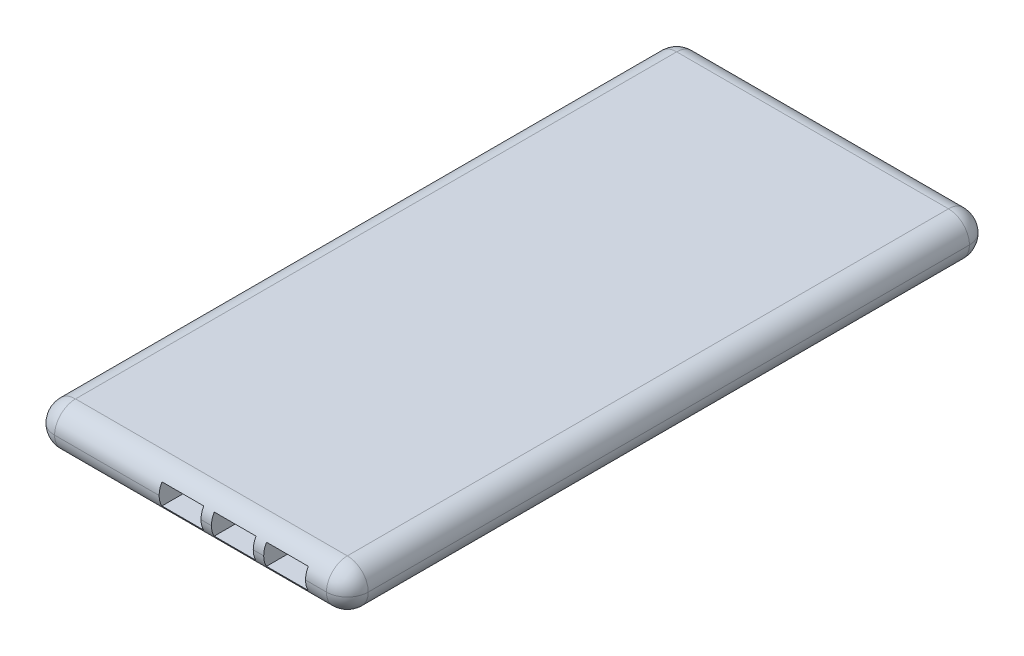
ISO-10303-21;
HEADER;
FILE_DESCRIPTION(('STEP AP214'),'2;1');
FILE_NAME('part.step','',(''),(''),'','','');
FILE_SCHEMA(('AUTOMOTIVE_DESIGN { 1 0 10303 214 1 1 1 1 }'));
ENDSEC;
DATA;
#1=APPLICATION_CONTEXT('core data for automotive mechanical design processes');
#2=APPLICATION_PROTOCOL_DEFINITION('international standard','automotive_design',2000,#1);
#3=PRODUCT_CONTEXT('',#1,'mechanical');
#4=PRODUCT('Part','Part','',(#3));
#5=PRODUCT_RELATED_PRODUCT_CATEGORY('part','',(#4));
#6=PRODUCT_DEFINITION_FORMATION('','',#4);
#7=PRODUCT_DEFINITION_CONTEXT('part definition',#1,'design');
#8=PRODUCT_DEFINITION('design','',#6,#7);
#9=PRODUCT_DEFINITION_SHAPE('','',#8);
#10=(LENGTH_UNIT() NAMED_UNIT(*) SI_UNIT(.MILLI.,.METRE.));
#11=(NAMED_UNIT(*) PLANE_ANGLE_UNIT() SI_UNIT($,.RADIAN.));
#12=(NAMED_UNIT(*) SI_UNIT($,.STERADIAN.) SOLID_ANGLE_UNIT());
#13=UNCERTAINTY_MEASURE_WITH_UNIT(LENGTH_MEASURE(1.E-05),#10,'distance_accuracy_value','');
#14=(GEOMETRIC_REPRESENTATION_CONTEXT(3) GLOBAL_UNCERTAINTY_ASSIGNED_CONTEXT((#13)) GLOBAL_UNIT_ASSIGNED_CONTEXT((#10,
#11,#12)) REPRESENTATION_CONTEXT('',''));
#15=CARTESIAN_POINT('',(0.,0.,0.));
#16=DIRECTION('',(0.,0.,1.));
#17=DIRECTION('',(1.,0.,0.));
#18=AXIS2_PLACEMENT_3D('',#15,#16,#17);
#19=CARTESIAN_POINT('',(0.,6.35,-6.35));
#20=DIRECTION('',(-1.,0.,0.));
#21=DIRECTION('',(0.,0.,1.));
#22=AXIS2_PLACEMENT_3D('',#19,#20,#21);
#23=CYLINDRICAL_SURFACE('',#22,6.35);
#24=DIRECTION('',(1.,0.,0.));
#25=VECTOR('',#24,1.);
#26=CARTESIAN_POINT('',(95.25,6.35,0.));
#27=LINE('',#26,#25);
#28=CARTESIAN_POINT('',(82.55,6.35,0.));
#29=VERTEX_POINT('',#28);
#30=CARTESIAN_POINT('',(88.9,6.35,0.));
#31=VERTEX_POINT('',#30);
#32=EDGE_CURVE('E319',#29,#31,#27,.T.);
#33=ORIENTED_EDGE('',*,*,#32,.F.);
#34=CARTESIAN_POINT('',(82.55,6.35,-6.35));
#35=DIRECTION('',(-1.,0.,0.));
#36=DIRECTION('',(0.,0.,1.));
#37=AXIS2_PLACEMENT_3D('',#34,#35,#36);
#38=CIRCLE('',#37,6.35);
#39=CARTESIAN_POINT('',(82.55,3.175,-0.850738685968817));
#40=VERTEX_POINT('',#39);
#41=EDGE_CURVE('E275',#29,#40,#38,.F.);
#42=ORIENTED_EDGE('',*,*,#41,.T.);
#43=DIRECTION('',(-1.,0.,0.));
#44=VECTOR('',#43,1.);
#45=CARTESIAN_POINT('',(0.,3.175,-0.850738685968816));
#46=LINE('',#45,#44);
#47=CARTESIAN_POINT('',(69.85,3.175,-0.850738685968816));
#48=VERTEX_POINT('',#47);
#49=EDGE_CURVE('E11',#40,#48,#46,.T.);
#50=ORIENTED_EDGE('',*,*,#49,.T.);
#51=CARTESIAN_POINT('',(69.85,6.35,-6.35));
#52=DIRECTION('',(1.,0.,0.));
#53=DIRECTION('',(0.,0.,-1.));
#54=AXIS2_PLACEMENT_3D('',#51,#52,#53);
#55=CIRCLE('',#54,6.35);
#56=CARTESIAN_POINT('',(69.85,6.35,0.));
#57=VERTEX_POINT('',#56);
#58=EDGE_CURVE('E272',#48,#57,#55,.F.);
#59=ORIENTED_EDGE('',*,*,#58,.T.);
#60=CARTESIAN_POINT('',(66.675,6.35,0.));
#61=VERTEX_POINT('',#60);
#62=EDGE_CURVE('E417',#61,#57,#27,.T.);
#63=ORIENTED_EDGE('',*,*,#62,.F.);
#64=CARTESIAN_POINT('',(66.675,6.35,-6.35));
#65=DIRECTION('',(-1.,0.,0.));
#66=DIRECTION('',(0.,0.,1.));
#67=AXIS2_PLACEMENT_3D('',#64,#65,#66);
#68=CIRCLE('',#67,6.35);
#69=CARTESIAN_POINT('',(66.675,3.175,-0.850738685968817));
#70=VERTEX_POINT('',#69);
#71=EDGE_CURVE('E64',#61,#70,#68,.F.);
#72=ORIENTED_EDGE('',*,*,#71,.T.);
#73=DIRECTION('',(-1.,0.,0.));
#74=VECTOR('',#73,1.);
#75=CARTESIAN_POINT('',(0.,3.175,-0.850738685968816));
#76=LINE('',#75,#74);
#77=CARTESIAN_POINT('',(53.975,3.175,-0.850738685968817));
#78=VERTEX_POINT('',#77);
#79=EDGE_CURVE('E49',#70,#78,#76,.T.);
#80=ORIENTED_EDGE('',*,*,#79,.T.);
#81=CARTESIAN_POINT('',(53.975,6.35,-6.35));
#82=DIRECTION('',(1.,0.,0.));
#83=DIRECTION('',(0.,0.,-1.));
#84=AXIS2_PLACEMENT_3D('',#81,#82,#83);
#85=CIRCLE('',#84,6.35);
#86=CARTESIAN_POINT('',(53.975,6.35,0.));
#87=VERTEX_POINT('',#86);
#88=EDGE_CURVE('E269',#78,#87,#85,.F.);
#89=ORIENTED_EDGE('',*,*,#88,.T.);
#90=CARTESIAN_POINT('',(50.8,6.35,0.));
#91=VERTEX_POINT('',#90);
#92=EDGE_CURVE('E324',#91,#87,#27,.T.);
#93=ORIENTED_EDGE('',*,*,#92,.F.);
#94=CARTESIAN_POINT('',(50.8,6.35,-6.35));
#95=DIRECTION('',(-1.,0.,0.));
#96=DIRECTION('',(0.,0.,1.));
#97=AXIS2_PLACEMENT_3D('',#94,#95,#96);
#98=CIRCLE('',#97,6.35);
#99=CARTESIAN_POINT('',(50.8,3.175,-0.850738685968817));
#100=VERTEX_POINT('',#99);
#101=EDGE_CURVE('E216',#91,#100,#98,.F.);
#102=ORIENTED_EDGE('',*,*,#101,.T.);
#103=DIRECTION('',(-1.,0.,0.));
#104=VECTOR('',#103,1.);
#105=CARTESIAN_POINT('',(0.,3.175,-0.850738685968816));
#106=LINE('',#105,#104);
#107=CARTESIAN_POINT('',(38.1,3.175,-0.850738685968817));
#108=VERTEX_POINT('',#107);
#109=EDGE_CURVE('E388',#100,#108,#106,.T.);
#110=ORIENTED_EDGE('',*,*,#109,.T.);
#111=CARTESIAN_POINT('',(38.1,6.35,-6.35));
#112=DIRECTION('',(-1.,0.,0.));
#113=DIRECTION('',(0.,0.,1.));
#114=AXIS2_PLACEMENT_3D('',#111,#112,#113);
#115=CIRCLE('',#114,6.35);
#116=CARTESIAN_POINT('',(38.1,6.35,0.));
#117=VERTEX_POINT('',#116);
#118=EDGE_CURVE('E220',#117,#108,#115,.F.);
#119=ORIENTED_EDGE('',*,*,#118,.F.);
#120=CARTESIAN_POINT('',(6.35,6.35,0.));
#121=VERTEX_POINT('',#120);
#122=EDGE_CURVE('E320',#121,#117,#27,.T.);
#123=ORIENTED_EDGE('',*,*,#122,.F.);
#124=CARTESIAN_POINT('',(6.35,6.35,-6.35));
#125=DIRECTION('',(-1.,0.,0.));
#126=DIRECTION('',(0.,0.,1.));
#127=AXIS2_PLACEMENT_3D('',#124,#125,#126);
#128=CIRCLE('',#127,6.35);
#129=CARTESIAN_POINT('',(6.35,0.,-6.35));
#130=VERTEX_POINT('',#129);
#131=EDGE_CURVE('E339',#130,#121,#128,.T.);
#132=ORIENTED_EDGE('',*,*,#131,.F.);
#133=DIRECTION('',(1.,0.,0.));
#134=VECTOR('',#133,1.);
#135=CARTESIAN_POINT('',(0.,0.,-6.35));
#136=LINE('',#135,#134);
#137=CARTESIAN_POINT('',(88.9,0.,-6.35));
#138=VERTEX_POINT('',#137);
#139=EDGE_CURVE('E288',#138,#130,#136,.F.);
#140=ORIENTED_EDGE('',*,*,#139,.F.);
#141=CARTESIAN_POINT('',(88.9,6.35,-6.35));
#142=DIRECTION('',(1.,0.,0.));
#143=DIRECTION('',(0.,0.,-1.));
#144=AXIS2_PLACEMENT_3D('',#141,#142,#143);
#145=CIRCLE('',#144,6.35);
#146=EDGE_CURVE('E341',#138,#31,#145,.F.);
#147=ORIENTED_EDGE('',*,*,#146,.T.);
#148=EDGE_LOOP('',(#33,#42,#50,#59,#63,#72,#80,#89,#93,#102,#110,#119,#123,#132,#140,#147));
#149=FACE_BOUND('',#148,.T.);
#150=ADVANCED_FACE('F41',(#149),#23,.T.);
#151=CARTESIAN_POINT('',(0.,6.35,-6.35));
#152=DIRECTION('',(1.,0.,0.));
#153=DIRECTION('',(0.,0.,-1.));
#154=AXIS2_PLACEMENT_3D('',#151,#152,#153);
#155=CYLINDRICAL_SURFACE('',#154,6.35);
#156=DIRECTION('',(1.,0.,0.));
#157=VECTOR('',#156,1.);
#158=CARTESIAN_POINT('',(0.,9.52499999999999,-0.850738685968808));
#159=LINE('',#158,#157);
#160=CARTESIAN_POINT('',(82.55,9.52499999999999,-0.850738685968808));
#161=VERTEX_POINT('',#160);
#162=CARTESIAN_POINT('',(69.85,9.525,-0.850738685968808));
#163=VERTEX_POINT('',#162);
#164=EDGE_CURVE('E380',#161,#163,#159,.F.);
#165=ORIENTED_EDGE('',*,*,#164,.F.);
#166=CARTESIAN_POINT('',(82.55,6.35,-6.35));
#167=DIRECTION('',(-1.,0.,0.));
#168=DIRECTION('',(0.,0.,1.));
#169=AXIS2_PLACEMENT_3D('',#166,#167,#168);
#170=CIRCLE('',#169,6.35);
#171=EDGE_CURVE('E385',#161,#29,#170,.F.);
#172=ORIENTED_EDGE('',*,*,#171,.T.);
#173=ORIENTED_EDGE('',*,*,#32,.T.);
#174=CARTESIAN_POINT('',(88.9,6.35,-6.35));
#175=DIRECTION('',(1.,0.,0.));
#176=DIRECTION('',(0.,0.,-1.));
#177=AXIS2_PLACEMENT_3D('',#174,#175,#176);
#178=CIRCLE('',#177,6.35);
#179=CARTESIAN_POINT('',(88.9,12.7,-6.35));
#180=VERTEX_POINT('',#179);
#181=EDGE_CURVE('E323',#31,#180,#178,.F.);
#182=ORIENTED_EDGE('',*,*,#181,.T.);
#183=DIRECTION('',(1.,0.,0.));
#184=VECTOR('',#183,1.);
#185=CARTESIAN_POINT('',(0.,12.7,-6.35));
#186=LINE('',#185,#184);
#187=CARTESIAN_POINT('',(6.35,12.7,-6.35));
#188=VERTEX_POINT('',#187);
#189=EDGE_CURVE('E278',#188,#180,#186,.T.);
#190=ORIENTED_EDGE('',*,*,#189,.F.);
#191=CARTESIAN_POINT('',(6.35,6.35,-6.35));
#192=DIRECTION('',(-1.,0.,0.));
#193=DIRECTION('',(0.,0.,1.));
#194=AXIS2_PLACEMENT_3D('',#191,#192,#193);
#195=CIRCLE('',#194,6.35);
#196=EDGE_CURVE('E305',#121,#188,#195,.T.);
#197=ORIENTED_EDGE('',*,*,#196,.F.);
#198=ORIENTED_EDGE('',*,*,#122,.T.);
#199=CARTESIAN_POINT('',(38.1,6.35,-6.35));
#200=DIRECTION('',(-1.,0.,0.));
#201=DIRECTION('',(0.,0.,1.));
#202=AXIS2_PLACEMENT_3D('',#199,#200,#201);
#203=CIRCLE('',#202,6.35);
#204=CARTESIAN_POINT('',(38.1,9.525,-0.850738685968811));
#205=VERTEX_POINT('',#204);
#206=EDGE_CURVE('E371',#205,#117,#203,.F.);
#207=ORIENTED_EDGE('',*,*,#206,.F.);
#208=DIRECTION('',(1.,0.,0.));
#209=VECTOR('',#208,1.);
#210=CARTESIAN_POINT('',(0.,9.525,-0.850738685968811));
#211=LINE('',#210,#209);
#212=CARTESIAN_POINT('',(50.8,9.525,-0.850738685968811));
#213=VERTEX_POINT('',#212);
#214=EDGE_CURVE('E369',#213,#205,#211,.F.);
#215=ORIENTED_EDGE('',*,*,#214,.F.);
#216=CARTESIAN_POINT('',(50.8,6.35,-6.35));
#217=DIRECTION('',(-1.,0.,0.));
#218=DIRECTION('',(0.,0.,1.));
#219=AXIS2_PLACEMENT_3D('',#216,#217,#218);
#220=CIRCLE('',#219,6.35);
#221=EDGE_CURVE('E297',#213,#91,#220,.F.);
#222=ORIENTED_EDGE('',*,*,#221,.T.);
#223=ORIENTED_EDGE('',*,*,#92,.T.);
#224=CARTESIAN_POINT('',(53.975,6.35,-6.35));
#225=DIRECTION('',(1.,0.,0.));
#226=DIRECTION('',(0.,0.,-1.));
#227=AXIS2_PLACEMENT_3D('',#224,#225,#226);
#228=CIRCLE('',#227,6.35);
#229=CARTESIAN_POINT('',(53.975,9.525,-0.850738685968808));
#230=VERTEX_POINT('',#229);
#231=EDGE_CURVE('E377',#87,#230,#228,.F.);
#232=ORIENTED_EDGE('',*,*,#231,.T.);
#233=DIRECTION('',(1.,0.,0.));
#234=VECTOR('',#233,1.);
#235=CARTESIAN_POINT('',(0.,9.52499999999999,-0.850738685968808));
#236=LINE('',#235,#234);
#237=CARTESIAN_POINT('',(66.675,9.525,-0.850738685968812));
#238=VERTEX_POINT('',#237);
#239=EDGE_CURVE('E375',#238,#230,#236,.F.);
#240=ORIENTED_EDGE('',*,*,#239,.F.);
#241=CARTESIAN_POINT('',(66.675,6.35,-6.35));
#242=DIRECTION('',(-1.,0.,0.));
#243=DIRECTION('',(0.,0.,1.));
#244=AXIS2_PLACEMENT_3D('',#241,#242,#243);
#245=CIRCLE('',#244,6.35);
#246=EDGE_CURVE('E373',#238,#61,#245,.F.);
#247=ORIENTED_EDGE('',*,*,#246,.T.);
#248=ORIENTED_EDGE('',*,*,#62,.T.);
#249=CARTESIAN_POINT('',(69.85,6.35,-6.35));
#250=DIRECTION('',(1.,0.,0.));
#251=DIRECTION('',(0.,0.,-1.));
#252=AXIS2_PLACEMENT_3D('',#249,#250,#251);
#253=CIRCLE('',#252,6.35);
#254=EDGE_CURVE('E382',#57,#163,#253,.F.);
#255=ORIENTED_EDGE('',*,*,#254,.T.);
#256=EDGE_LOOP('',(#165,#172,#173,#182,#190,#197,#198,#207,#215,#222,#223,#232,#240,#247,#248,#255));
#257=FACE_BOUND('',#256,.T.);
#258=ADVANCED_FACE('F415',(#257),#155,.T.);
#259=CARTESIAN_POINT('',(0.,12.7,0.));
#260=DIRECTION('',(0.,-1.,0.));
#261=DIRECTION('',(0.,0.,-1.));
#262=AXIS2_PLACEMENT_3D('',#259,#260,#261);
#263=PLANE('',#262);
#264=DIRECTION('',(-1.,0.,0.));
#265=VECTOR('',#264,1.);
#266=CARTESIAN_POINT('',(0.,12.7,-188.9125));
#267=LINE('',#266,#265);
#268=CARTESIAN_POINT('',(88.9,12.7,-188.9125));
#269=VERTEX_POINT('',#268);
#270=CARTESIAN_POINT('',(6.35,12.7,-188.9125));
#271=VERTEX_POINT('',#270);
#272=EDGE_CURVE('E283',#269,#271,#267,.T.);
#273=ORIENTED_EDGE('',*,*,#272,.T.);
#274=DIRECTION('',(0.,0.,1.));
#275=VECTOR('',#274,1.);
#276=CARTESIAN_POINT('',(6.35,12.7,0.));
#277=LINE('',#276,#275);
#278=EDGE_CURVE('E285',#271,#188,#277,.T.);
#279=ORIENTED_EDGE('',*,*,#278,.T.);
#280=ORIENTED_EDGE('',*,*,#189,.T.);
#281=DIRECTION('',(0.,0.,-1.));
#282=VECTOR('',#281,1.);
#283=CARTESIAN_POINT('',(88.9,12.7,0.));
#284=LINE('',#283,#282);
#285=EDGE_CURVE('E280',#180,#269,#284,.T.);
#286=ORIENTED_EDGE('',*,*,#285,.T.);
#287=EDGE_LOOP('',(#273,#279,#280,#286));
#288=FACE_BOUND('',#287,.T.);
#289=ADVANCED_FACE('F437',(#288),#263,.F.);
#290=CARTESIAN_POINT('',(0.,0.,0.));
#291=DIRECTION('',(0.,-1.,0.));
#292=DIRECTION('',(0.,0.,-1.));
#293=AXIS2_PLACEMENT_3D('',#290,#291,#292);
#294=PLANE('',#293);
#295=ORIENTED_EDGE('',*,*,#139,.T.);
#296=DIRECTION('',(0.,0.,1.));
#297=VECTOR('',#296,1.);
#298=CARTESIAN_POINT('',(6.35,0.,-195.2625));
#299=LINE('',#298,#297);
#300=CARTESIAN_POINT('',(6.35,0.,-188.9125));
#301=VERTEX_POINT('',#300);
#302=EDGE_CURVE('E294',#130,#301,#299,.F.);
#303=ORIENTED_EDGE('',*,*,#302,.T.);
#304=DIRECTION('',(-1.,0.,0.));
#305=VECTOR('',#304,1.);
#306=CARTESIAN_POINT('',(95.25,0.,-188.9125));
#307=LINE('',#306,#305);
#308=CARTESIAN_POINT('',(88.9,0.,-188.9125));
#309=VERTEX_POINT('',#308);
#310=EDGE_CURVE('E292',#301,#309,#307,.F.);
#311=ORIENTED_EDGE('',*,*,#310,.T.);
#312=DIRECTION('',(0.,0.,-1.));
#313=VECTOR('',#312,1.);
#314=CARTESIAN_POINT('',(88.9,0.,0.));
#315=LINE('',#314,#313);
#316=EDGE_CURVE('E290',#309,#138,#315,.F.);
#317=ORIENTED_EDGE('',*,*,#316,.T.);
#318=EDGE_LOOP('',(#295,#303,#311,#317));
#319=FACE_BOUND('',#318,.T.);
#320=ADVANCED_FACE('F470',(#319),#294,.T.);
#321=CARTESIAN_POINT('',(88.9,6.35,0.));
#322=DIRECTION('',(0.,0.,1.));
#323=DIRECTION('',(1.,0.,0.));
#324=AXIS2_PLACEMENT_3D('',#321,#322,#323);
#325=CYLINDRICAL_SURFACE('',#324,6.35);
#326=CARTESIAN_POINT('',(88.9,6.35,-188.9125));
#327=DIRECTION('',(0.,0.,-1.));
#328=DIRECTION('',(-1.,0.,0.));
#329=AXIS2_PLACEMENT_3D('',#326,#327,#328);
#330=CIRCLE('',#329,6.35);
#331=CARTESIAN_POINT('',(95.25,6.35,-188.9125));
#332=VERTEX_POINT('',#331);
#333=EDGE_CURVE('E281',#332,#309,#330,.T.);
#334=ORIENTED_EDGE('',*,*,#333,.F.);
#335=DIRECTION('',(0.,0.,-1.));
#336=VECTOR('',#335,1.);
#337=CARTESIAN_POINT('',(95.25,6.35,-195.2625));
#338=LINE('',#337,#336);
#339=CARTESIAN_POINT('',(95.25,6.35,-6.35));
#340=VERTEX_POINT('',#339);
#341=EDGE_CURVE('E359',#340,#332,#338,.T.);
#342=ORIENTED_EDGE('',*,*,#341,.F.);
#343=CARTESIAN_POINT('',(88.9,6.35,-6.35));
#344=DIRECTION('',(0.,0.,1.));
#345=DIRECTION('',(1.,0.,0.));
#346=AXIS2_PLACEMENT_3D('',#343,#344,#345);
#347=CIRCLE('',#346,6.35);
#348=EDGE_CURVE('E356',#138,#340,#347,.T.);
#349=ORIENTED_EDGE('',*,*,#348,.F.);
#350=ORIENTED_EDGE('',*,*,#316,.F.);
#351=EDGE_LOOP('',(#334,#342,#349,#350));
#352=FACE_BOUND('',#351,.T.);
#353=ADVANCED_FACE('F43',(#352),#325,.T.);
#354=CARTESIAN_POINT('',(88.9,6.35,-188.9125));
#355=DIRECTION('',(1.,0.,0.));
#356=DIRECTION('',(0.,0.,-1.));
#357=AXIS2_PLACEMENT_3D('',#354,#355,#356);
#358=SPHERICAL_SURFACE('',#357,6.35);
#359=CARTESIAN_POINT('',(88.9,6.35,-188.9125));
#360=DIRECTION('',(0.,-1.,0.));
#361=DIRECTION('',(0.,0.,-1.));
#362=AXIS2_PLACEMENT_3D('',#359,#360,#361);
#363=CIRCLE('',#362,6.35);
#364=CARTESIAN_POINT('',(88.9,6.35,-195.2625));
#365=VERTEX_POINT('',#364);
#366=EDGE_CURVE('E362',#332,#365,#363,.F.);
#367=ORIENTED_EDGE('',*,*,#366,.F.);
#368=ORIENTED_EDGE('',*,*,#333,.T.);
#369=CARTESIAN_POINT('',(88.9,6.35,-188.9125));
#370=DIRECTION('',(1.,0.,0.));
#371=DIRECTION('',(0.,0.,-1.));
#372=AXIS2_PLACEMENT_3D('',#369,#370,#371);
#373=CIRCLE('',#372,6.35);
#374=EDGE_CURVE('E353',#365,#309,#373,.F.);
#375=ORIENTED_EDGE('',*,*,#374,.F.);
#376=EDGE_LOOP('',(#367,#368,#375));
#377=FACE_BOUND('',#376,.T.);
#378=ADVANCED_FACE('F516',(#377),#358,.T.);
#379=CARTESIAN_POINT('',(88.9,6.35,0.));
#380=DIRECTION('',(0.,0.,-1.));
#381=DIRECTION('',(-1.,0.,0.));
#382=AXIS2_PLACEMENT_3D('',#379,#380,#381);
#383=CYLINDRICAL_SURFACE('',#382,6.35);
#384=CARTESIAN_POINT('',(88.9,6.35,-6.35));
#385=DIRECTION('',(0.,0.,1.));
#386=DIRECTION('',(1.,0.,0.));
#387=AXIS2_PLACEMENT_3D('',#384,#385,#386);
#388=CIRCLE('',#387,6.35);
#389=EDGE_CURVE('E347',#340,#180,#388,.T.);
#390=ORIENTED_EDGE('',*,*,#389,.F.);
#391=ORIENTED_EDGE('',*,*,#341,.T.);
#392=CARTESIAN_POINT('',(88.9,6.35,-188.9125));
#393=DIRECTION('',(0.,0.,-1.));
#394=DIRECTION('',(-1.,0.,0.));
#395=AXIS2_PLACEMENT_3D('',#392,#393,#394);
#396=CIRCLE('',#395,6.35);
#397=EDGE_CURVE('E350',#269,#332,#396,.T.);
#398=ORIENTED_EDGE('',*,*,#397,.F.);
#399=ORIENTED_EDGE('',*,*,#285,.F.);
#400=EDGE_LOOP('',(#390,#391,#398,#399));
#401=FACE_BOUND('',#400,.T.);
#402=ADVANCED_FACE('F433',(#401),#383,.T.);
#403=CARTESIAN_POINT('',(88.9,6.35,-6.35));
#404=DIRECTION('',(1.,0.,0.));
#405=DIRECTION('',(0.,0.,-1.));
#406=AXIS2_PLACEMENT_3D('',#403,#404,#405);
#407=SPHERICAL_SURFACE('',#406,6.35);
#408=ORIENTED_EDGE('',*,*,#348,.T.);
#409=CARTESIAN_POINT('',(88.9,6.35,-6.35));
#410=DIRECTION('',(0.,1.,0.));
#411=DIRECTION('',(0.,0.,1.));
#412=AXIS2_PLACEMENT_3D('',#409,#410,#411);
#413=CIRCLE('',#412,6.35);
#414=EDGE_CURVE('E344',#31,#340,#413,.T.);
#415=ORIENTED_EDGE('',*,*,#414,.F.);
#416=ORIENTED_EDGE('',*,*,#146,.F.);
#417=EDGE_LOOP('',(#408,#415,#416));
#418=FACE_BOUND('',#417,.T.);
#419=ADVANCED_FACE('F424',(#418),#407,.T.);
#420=CARTESIAN_POINT('',(0.,6.35,-188.9125));
#421=DIRECTION('',(1.,0.,0.));
#422=DIRECTION('',(0.,0.,-1.));
#423=AXIS2_PLACEMENT_3D('',#420,#421,#422);
#424=CYLINDRICAL_SURFACE('',#423,6.35);
#425=ORIENTED_EDGE('',*,*,#374,.T.);
#426=ORIENTED_EDGE('',*,*,#310,.F.);
#427=CARTESIAN_POINT('',(6.35,6.35,-188.9125));
#428=DIRECTION('',(-1.,0.,0.));
#429=DIRECTION('',(0.,0.,1.));
#430=AXIS2_PLACEMENT_3D('',#427,#428,#429);
#431=CIRCLE('',#430,6.35);
#432=CARTESIAN_POINT('',(6.35,6.35,-195.2625));
#433=VERTEX_POINT('',#432);
#434=EDGE_CURVE('E336',#433,#301,#431,.T.);
#435=ORIENTED_EDGE('',*,*,#434,.F.);
#436=DIRECTION('',(-1.,0.,0.));
#437=VECTOR('',#436,1.);
#438=CARTESIAN_POINT('',(0.,6.35,-195.2625));
#439=LINE('',#438,#437);
#440=EDGE_CURVE('E330',#365,#433,#439,.T.);
#441=ORIENTED_EDGE('',*,*,#440,.F.);
#442=EDGE_LOOP('',(#425,#426,#435,#441));
#443=FACE_BOUND('',#442,.T.);
#444=ADVANCED_FACE('F467',(#443),#424,.T.);
#445=CARTESIAN_POINT('',(88.9,6.35,-188.9125));
#446=DIRECTION('',(1.,0.,0.));
#447=DIRECTION('',(0.,0.,-1.));
#448=AXIS2_PLACEMENT_3D('',#445,#446,#447);
#449=SPHERICAL_SURFACE('',#448,6.35);
#450=ORIENTED_EDGE('',*,*,#397,.T.);
#451=ORIENTED_EDGE('',*,*,#366,.T.);
#452=CARTESIAN_POINT('',(88.9,6.35,-188.9125));
#453=DIRECTION('',(1.,0.,0.));
#454=DIRECTION('',(0.,0.,-1.));
#455=AXIS2_PLACEMENT_3D('',#452,#453,#454);
#456=CIRCLE('',#455,6.35);
#457=EDGE_CURVE('E327',#269,#365,#456,.F.);
#458=ORIENTED_EDGE('',*,*,#457,.F.);
#459=EDGE_LOOP('',(#450,#451,#458));
#460=FACE_BOUND('',#459,.T.);
#461=ADVANCED_FACE('F507',(#460),#449,.T.);
#462=CARTESIAN_POINT('',(88.9,6.35,-6.35));
#463=DIRECTION('',(1.,0.,0.));
#464=DIRECTION('',(0.,0.,-1.));
#465=AXIS2_PLACEMENT_3D('',#462,#463,#464);
#466=SPHERICAL_SURFACE('',#465,6.35);
#467=ORIENTED_EDGE('',*,*,#414,.T.);
#468=ORIENTED_EDGE('',*,*,#389,.T.);
#469=ORIENTED_EDGE('',*,*,#181,.F.);
#470=EDGE_LOOP('',(#467,#468,#469));
#471=FACE_BOUND('',#470,.T.);
#472=ADVANCED_FACE('F430',(#471),#466,.T.);
#473=CARTESIAN_POINT('',(6.35,6.35,-6.35));
#474=DIRECTION('',(0.,0.,1.));
#475=DIRECTION('',(1.,0.,0.));
#476=AXIS2_PLACEMENT_3D('',#473,#474,#475);
#477=SPHERICAL_SURFACE('',#476,6.35);
#478=CARTESIAN_POINT('',(6.35,6.35,-6.35));
#479=DIRECTION('',(0.,0.,1.));
#480=DIRECTION('',(1.,0.,0.));
#481=AXIS2_PLACEMENT_3D('',#478,#479,#480);
#482=CIRCLE('',#481,6.35);
#483=CARTESIAN_POINT('',(0.,6.35,-6.35));
#484=VERTEX_POINT('',#483);
#485=EDGE_CURVE('E313',#130,#484,#482,.F.);
#486=ORIENTED_EDGE('',*,*,#485,.F.);
#487=ORIENTED_EDGE('',*,*,#131,.T.);
#488=CARTESIAN_POINT('',(6.35,6.35,-6.35));
#489=DIRECTION('',(0.,-1.,0.));
#490=DIRECTION('',(0.,0.,-1.));
#491=AXIS2_PLACEMENT_3D('',#488,#489,#490);
#492=CIRCLE('',#491,6.35);
#493=EDGE_CURVE('E316',#484,#121,#492,.F.);
#494=ORIENTED_EDGE('',*,*,#493,.F.);
#495=EDGE_LOOP('',(#486,#487,#494));
#496=FACE_BOUND('',#495,.T.);
#497=ADVANCED_FACE('F449',(#496),#477,.T.);
#498=CARTESIAN_POINT('',(6.35,6.35,-188.9125));
#499=DIRECTION('',(0.,0.,-1.));
#500=DIRECTION('',(-1.,0.,0.));
#501=AXIS2_PLACEMENT_3D('',#498,#499,#500);
#502=SPHERICAL_SURFACE('',#501,6.35);
#503=CARTESIAN_POINT('',(6.35,6.35,-188.9125));
#504=DIRECTION('',(0.,-1.,0.));
#505=DIRECTION('',(0.,0.,-1.));
#506=AXIS2_PLACEMENT_3D('',#503,#504,#505);
#507=CIRCLE('',#506,6.35);
#508=CARTESIAN_POINT('',(0.,6.35,-188.9125));
#509=VERTEX_POINT('',#508);
#510=EDGE_CURVE('E333',#433,#509,#507,.F.);
#511=ORIENTED_EDGE('',*,*,#510,.F.);
#512=ORIENTED_EDGE('',*,*,#434,.T.);
#513=CARTESIAN_POINT('',(6.35,6.35,-188.9125));
#514=DIRECTION('',(0.,0.,-1.));
#515=DIRECTION('',(-1.,0.,0.));
#516=AXIS2_PLACEMENT_3D('',#513,#514,#515);
#517=CIRCLE('',#516,6.35);
#518=EDGE_CURVE('E311',#509,#301,#517,.F.);
#519=ORIENTED_EDGE('',*,*,#518,.F.);
#520=EDGE_LOOP('',(#511,#512,#519));
#521=FACE_BOUND('',#520,.T.);
#522=ADVANCED_FACE('F461',(#521),#502,.T.);
#523=CARTESIAN_POINT('',(0.,6.35,-188.9125));
#524=DIRECTION('',(-1.,0.,0.));
#525=DIRECTION('',(0.,0.,1.));
#526=AXIS2_PLACEMENT_3D('',#523,#524,#525);
#527=CYLINDRICAL_SURFACE('',#526,6.35);
#528=ORIENTED_EDGE('',*,*,#457,.T.);
#529=ORIENTED_EDGE('',*,*,#440,.T.);
#530=CARTESIAN_POINT('',(6.35,6.35,-188.9125));
#531=DIRECTION('',(-1.,0.,0.));
#532=DIRECTION('',(0.,0.,1.));
#533=AXIS2_PLACEMENT_3D('',#530,#531,#532);
#534=CIRCLE('',#533,6.35);
#535=EDGE_CURVE('E308',#271,#433,#534,.T.);
#536=ORIENTED_EDGE('',*,*,#535,.F.);
#537=ORIENTED_EDGE('',*,*,#272,.F.);
#538=EDGE_LOOP('',(#528,#529,#536,#537));
#539=FACE_BOUND('',#538,.T.);
#540=ADVANCED_FACE('F465',(#539),#527,.T.);
#541=CARTESIAN_POINT('',(6.35,6.35,0.));
#542=DIRECTION('',(0.,0.,-1.));
#543=DIRECTION('',(-1.,0.,0.));
#544=AXIS2_PLACEMENT_3D('',#541,#542,#543);
#545=CYLINDRICAL_SURFACE('',#544,6.35);
#546=ORIENTED_EDGE('',*,*,#302,.F.);
#547=ORIENTED_EDGE('',*,*,#485,.T.);
#548=DIRECTION('',(0.,0.,1.));
#549=VECTOR('',#548,1.);
#550=CARTESIAN_POINT('',(0.,6.35,0.));
#551=LINE('',#550,#549);
#552=EDGE_CURVE('E302',#509,#484,#551,.T.);
#553=ORIENTED_EDGE('',*,*,#552,.F.);
#554=ORIENTED_EDGE('',*,*,#518,.T.);
#555=EDGE_LOOP('',(#546,#547,#553,#554));
#556=FACE_BOUND('',#555,.T.);
#557=ADVANCED_FACE('F453',(#556),#545,.T.);
#558=CARTESIAN_POINT('',(6.35,6.35,-188.9125));
#559=DIRECTION('',(0.,0.,-1.));
#560=DIRECTION('',(-1.,0.,0.));
#561=AXIS2_PLACEMENT_3D('',#558,#559,#560);
#562=SPHERICAL_SURFACE('',#561,6.35);
#563=ORIENTED_EDGE('',*,*,#535,.T.);
#564=ORIENTED_EDGE('',*,*,#510,.T.);
#565=CARTESIAN_POINT('',(6.35,6.35,-188.9125));
#566=DIRECTION('',(0.,0.,-1.));
#567=DIRECTION('',(-1.,0.,0.));
#568=AXIS2_PLACEMENT_3D('',#565,#566,#567);
#569=CIRCLE('',#568,6.35);
#570=EDGE_CURVE('E299',#271,#509,#569,.F.);
#571=ORIENTED_EDGE('',*,*,#570,.F.);
#572=EDGE_LOOP('',(#563,#564,#571));
#573=FACE_BOUND('',#572,.T.);
#574=ADVANCED_FACE('F458',(#573),#562,.T.);
#575=CARTESIAN_POINT('',(6.35,6.35,-6.35));
#576=DIRECTION('',(0.,0.,1.));
#577=DIRECTION('',(1.,0.,0.));
#578=AXIS2_PLACEMENT_3D('',#575,#576,#577);
#579=SPHERICAL_SURFACE('',#578,6.35);
#580=ORIENTED_EDGE('',*,*,#493,.T.);
#581=ORIENTED_EDGE('',*,*,#196,.T.);
#582=CARTESIAN_POINT('',(6.35,6.35,-6.35));
#583=DIRECTION('',(0.,0.,1.));
#584=DIRECTION('',(1.,0.,0.));
#585=AXIS2_PLACEMENT_3D('',#582,#583,#584);
#586=CIRCLE('',#585,6.35);
#587=EDGE_CURVE('E277',#484,#188,#586,.F.);
#588=ORIENTED_EDGE('',*,*,#587,.F.);
#589=EDGE_LOOP('',(#580,#581,#588));
#590=FACE_BOUND('',#589,.T.);
#591=ADVANCED_FACE('F446',(#590),#579,.T.);
#592=CARTESIAN_POINT('',(6.35,6.35,0.));
#593=DIRECTION('',(0.,0.,1.));
#594=DIRECTION('',(1.,0.,0.));
#595=AXIS2_PLACEMENT_3D('',#592,#593,#594);
#596=CYLINDRICAL_SURFACE('',#595,6.35);
#597=ORIENTED_EDGE('',*,*,#570,.T.);
#598=ORIENTED_EDGE('',*,*,#552,.T.);
#599=ORIENTED_EDGE('',*,*,#587,.T.);
#600=ORIENTED_EDGE('',*,*,#278,.F.);
#601=EDGE_LOOP('',(#597,#598,#599,#600));
#602=FACE_BOUND('',#601,.T.);
#603=ADVANCED_FACE('F455',(#602),#596,.T.);
#604=CARTESIAN_POINT('',(38.1,9.525,-12.7));
#605=DIRECTION('',(-1.,0.,0.));
#606=DIRECTION('',(0.,0.,1.));
#607=AXIS2_PLACEMENT_3D('',#604,#605,#606);
#608=PLANE('',#607);
#609=ORIENTED_EDGE('',*,*,#118,.T.);
#610=DIRECTION('',(0.,0.,1.));
#611=VECTOR('',#610,1.);
#612=CARTESIAN_POINT('',(38.1,3.175,-12.7));
#613=LINE('',#612,#611);
#614=CARTESIAN_POINT('',(38.1,3.175,-12.7));
#615=VERTEX_POINT('',#614);
#616=EDGE_CURVE('E246',#615,#108,#613,.T.);
#617=ORIENTED_EDGE('',*,*,#616,.F.);
#618=DIRECTION('',(0.,-1.,0.));
#619=VECTOR('',#618,1.);
#620=CARTESIAN_POINT('',(38.1,9.525,-12.7));
#621=LINE('',#620,#619);
#622=CARTESIAN_POINT('',(38.1,9.525,-12.7));
#623=VERTEX_POINT('',#622);
#624=EDGE_CURVE('E230',#623,#615,#621,.T.);
#625=ORIENTED_EDGE('',*,*,#624,.F.);
#626=DIRECTION('',(0.,0.,1.));
#627=VECTOR('',#626,1.);
#628=CARTESIAN_POINT('',(38.1,9.525,-12.7));
#629=LINE('',#628,#627);
#630=EDGE_CURVE('E256',#623,#205,#629,.T.);
#631=ORIENTED_EDGE('',*,*,#630,.T.);
#632=ORIENTED_EDGE('',*,*,#206,.T.);
#633=EDGE_LOOP('',(#609,#617,#625,#631,#632));
#634=FACE_BOUND('',#633,.T.);
#635=ADVANCED_FACE('F474',(#634),#608,.F.);
#636=CARTESIAN_POINT('',(50.8,9.525,-12.7));
#637=DIRECTION('',(0.,1.,0.));
#638=DIRECTION('',(0.,0.,1.));
#639=AXIS2_PLACEMENT_3D('',#636,#637,#638);
#640=PLANE('',#639);
#641=ORIENTED_EDGE('',*,*,#214,.T.);
#642=ORIENTED_EDGE('',*,*,#630,.F.);
#643=DIRECTION('',(-1.,0.,0.));
#644=VECTOR('',#643,1.);
#645=CARTESIAN_POINT('',(50.8,9.525,-12.7));
#646=LINE('',#645,#644);
#647=CARTESIAN_POINT('',(50.8,9.525,-12.7));
#648=VERTEX_POINT('',#647);
#649=EDGE_CURVE('E249',#648,#623,#646,.T.);
#650=ORIENTED_EDGE('',*,*,#649,.F.);
#651=DIRECTION('',(0.,0.,1.));
#652=VECTOR('',#651,1.);
#653=CARTESIAN_POINT('',(50.8,9.525,-12.7));
#654=LINE('',#653,#652);
#655=EDGE_CURVE('E253',#648,#213,#654,.T.);
#656=ORIENTED_EDGE('',*,*,#655,.T.);
#657=EDGE_LOOP('',(#641,#642,#650,#656));
#658=FACE_BOUND('',#657,.T.);
#659=ADVANCED_FACE('F485',(#658),#640,.F.);
#660=CARTESIAN_POINT('',(50.8,9.525,-12.7));
#661=DIRECTION('',(-1.,0.,0.));
#662=DIRECTION('',(0.,0.,1.));
#663=AXIS2_PLACEMENT_3D('',#660,#661,#662);
#664=PLANE('',#663);
#665=ORIENTED_EDGE('',*,*,#221,.F.);
#666=ORIENTED_EDGE('',*,*,#655,.F.);
#667=DIRECTION('',(0.,-1.,0.));
#668=VECTOR('',#667,1.);
#669=CARTESIAN_POINT('',(50.8,9.525,-12.7));
#670=LINE('',#669,#668);
#671=CARTESIAN_POINT('',(50.8,3.175,-12.7));
#672=VERTEX_POINT('',#671);
#673=EDGE_CURVE('E261',#648,#672,#670,.T.);
#674=ORIENTED_EDGE('',*,*,#673,.T.);
#675=DIRECTION('',(0.,0.,1.));
#676=VECTOR('',#675,1.);
#677=CARTESIAN_POINT('',(50.8,3.175,-12.7));
#678=LINE('',#677,#676);
#679=EDGE_CURVE('E250',#672,#100,#678,.T.);
#680=ORIENTED_EDGE('',*,*,#679,.T.);
#681=ORIENTED_EDGE('',*,*,#101,.F.);
#682=EDGE_LOOP('',(#665,#666,#674,#680,#681));
#683=FACE_BOUND('',#682,.T.);
#684=ADVANCED_FACE('F487',(#683),#664,.T.);
#685=CARTESIAN_POINT('',(50.8,3.175,-12.7));
#686=DIRECTION('',(0.,1.,0.));
#687=DIRECTION('',(0.,0.,1.));
#688=AXIS2_PLACEMENT_3D('',#685,#686,#687);
#689=PLANE('',#688);
#690=ORIENTED_EDGE('',*,*,#679,.F.);
#691=DIRECTION('',(-1.,0.,0.));
#692=VECTOR('',#691,1.);
#693=CARTESIAN_POINT('',(50.8,3.175,-12.7));
#694=LINE('',#693,#692);
#695=EDGE_CURVE('E263',#672,#615,#694,.T.);
#696=ORIENTED_EDGE('',*,*,#695,.T.);
#697=ORIENTED_EDGE('',*,*,#616,.T.);
#698=ORIENTED_EDGE('',*,*,#109,.F.);
#699=EDGE_LOOP('',(#690,#696,#697,#698));
#700=FACE_BOUND('',#699,.T.);
#701=ADVANCED_FACE('F478',(#700),#689,.T.);
#702=CARTESIAN_POINT('',(0.,0.,-12.7));
#703=DIRECTION('',(0.,0.,-1.));
#704=DIRECTION('',(-1.,0.,0.));
#705=AXIS2_PLACEMENT_3D('',#702,#703,#704);
#706=PLANE('',#705);
#707=ORIENTED_EDGE('',*,*,#624,.T.);
#708=ORIENTED_EDGE('',*,*,#695,.F.);
#709=ORIENTED_EDGE('',*,*,#673,.F.);
#710=ORIENTED_EDGE('',*,*,#649,.T.);
#711=EDGE_LOOP('',(#707,#708,#709,#710));
#712=FACE_BOUND('',#711,.T.);
#713=ADVANCED_FACE('F482',(#712),#706,.F.);
#714=CARTESIAN_POINT('',(53.975,3.175,-12.7));
#715=DIRECTION('',(1.,0.,0.));
#716=DIRECTION('',(0.,0.,-1.));
#717=AXIS2_PLACEMENT_3D('',#714,#715,#716);
#718=PLANE('',#717);
#719=DIRECTION('',(0.,0.,1.));
#720=VECTOR('',#719,1.);
#721=CARTESIAN_POINT('',(53.975,3.175,-12.7));
#722=LINE('',#721,#720);
#723=CARTESIAN_POINT('',(53.975,3.175,-12.7));
#724=VERTEX_POINT('',#723);
#725=EDGE_CURVE('E235',#724,#78,#722,.T.);
#726=ORIENTED_EDGE('',*,*,#725,.F.);
#727=DIRECTION('',(0.,1.,0.));
#728=VECTOR('',#727,1.);
#729=CARTESIAN_POINT('',(53.975,3.175,-12.7));
#730=LINE('',#729,#728);
#731=CARTESIAN_POINT('',(53.975,9.525,-12.7));
#732=VERTEX_POINT('',#731);
#733=EDGE_CURVE('E213',#724,#732,#730,.T.);
#734=ORIENTED_EDGE('',*,*,#733,.T.);
#735=DIRECTION('',(0.,0.,1.));
#736=VECTOR('',#735,1.);
#737=CARTESIAN_POINT('',(53.975,9.525,-12.7));
#738=LINE('',#737,#736);
#739=EDGE_CURVE('E226',#732,#230,#738,.T.);
#740=ORIENTED_EDGE('',*,*,#739,.T.);
#741=ORIENTED_EDGE('',*,*,#231,.F.);
#742=ORIENTED_EDGE('',*,*,#88,.F.);
#743=EDGE_LOOP('',(#726,#734,#740,#741,#742));
#744=FACE_BOUND('',#743,.T.);
#745=ADVANCED_FACE('F412',(#744),#718,.T.);
#746=CARTESIAN_POINT('',(66.675,9.525,-12.7));
#747=DIRECTION('',(0.,1.,0.));
#748=DIRECTION('',(-1.,0.,0.));
#749=AXIS2_PLACEMENT_3D('',#746,#747,#748);
#750=PLANE('',#749);
#751=ORIENTED_EDGE('',*,*,#239,.T.);
#752=ORIENTED_EDGE('',*,*,#739,.F.);
#753=DIRECTION('',(-1.,0.,0.));
#754=VECTOR('',#753,1.);
#755=CARTESIAN_POINT('',(66.675,9.525,-12.7));
#756=LINE('',#755,#754);
#757=CARTESIAN_POINT('',(66.675,9.525,-12.7));
#758=VERTEX_POINT('',#757);
#759=EDGE_CURVE('E242',#758,#732,#756,.T.);
#760=ORIENTED_EDGE('',*,*,#759,.F.);
#761=DIRECTION('',(0.,0.,1.));
#762=VECTOR('',#761,1.);
#763=CARTESIAN_POINT('',(66.675,9.525,-12.7));
#764=LINE('',#763,#762);
#765=EDGE_CURVE('E229',#758,#238,#764,.T.);
#766=ORIENTED_EDGE('',*,*,#765,.T.);
#767=EDGE_LOOP('',(#751,#752,#760,#766));
#768=FACE_BOUND('',#767,.T.);
#769=ADVANCED_FACE('F409',(#768),#750,.F.);
#770=CARTESIAN_POINT('',(66.675,9.525,-12.7));
#771=DIRECTION('',(-1.,0.,0.));
#772=DIRECTION('',(0.,0.,1.));
#773=AXIS2_PLACEMENT_3D('',#770,#771,#772);
#774=PLANE('',#773);
#775=ORIENTED_EDGE('',*,*,#246,.F.);
#776=ORIENTED_EDGE('',*,*,#765,.F.);
#777=DIRECTION('',(0.,-1.,0.));
#778=VECTOR('',#777,1.);
#779=CARTESIAN_POINT('',(66.675,9.525,-12.7));
#780=LINE('',#779,#778);
#781=CARTESIAN_POINT('',(66.675,3.175,-12.7));
#782=VERTEX_POINT('',#781);
#783=EDGE_CURVE('E240',#758,#782,#780,.T.);
#784=ORIENTED_EDGE('',*,*,#783,.T.);
#785=DIRECTION('',(0.,0.,1.));
#786=VECTOR('',#785,1.);
#787=CARTESIAN_POINT('',(66.675,3.175,-12.7));
#788=LINE('',#787,#786);
#789=EDGE_CURVE('E233',#782,#70,#788,.T.);
#790=ORIENTED_EDGE('',*,*,#789,.T.);
#791=ORIENTED_EDGE('',*,*,#71,.F.);
#792=EDGE_LOOP('',(#775,#776,#784,#790,#791));
#793=FACE_BOUND('',#792,.T.);
#794=ADVANCED_FACE('F401',(#793),#774,.T.);
#795=CARTESIAN_POINT('',(66.675,3.175,-12.7));
#796=DIRECTION('',(0.,1.,0.));
#797=DIRECTION('',(0.,0.,1.));
#798=AXIS2_PLACEMENT_3D('',#795,#796,#797);
#799=PLANE('',#798);
#800=ORIENTED_EDGE('',*,*,#789,.F.);
#801=DIRECTION('',(-1.,0.,0.));
#802=VECTOR('',#801,1.);
#803=CARTESIAN_POINT('',(66.675,3.175,-12.7));
#804=LINE('',#803,#802);
#805=EDGE_CURVE('E238',#782,#724,#804,.T.);
#806=ORIENTED_EDGE('',*,*,#805,.T.);
#807=ORIENTED_EDGE('',*,*,#725,.T.);
#808=ORIENTED_EDGE('',*,*,#79,.F.);
#809=EDGE_LOOP('',(#800,#806,#807,#808));
#810=FACE_BOUND('',#809,.T.);
#811=ADVANCED_FACE('F398',(#810),#799,.T.);
#812=CARTESIAN_POINT('',(0.,0.,-12.7));
#813=DIRECTION('',(0.,0.,1.));
#814=DIRECTION('',(1.,0.,0.));
#815=AXIS2_PLACEMENT_3D('',#812,#813,#814);
#816=PLANE('',#815);
#817=ORIENTED_EDGE('',*,*,#733,.F.);
#818=ORIENTED_EDGE('',*,*,#805,.F.);
#819=ORIENTED_EDGE('',*,*,#783,.F.);
#820=ORIENTED_EDGE('',*,*,#759,.T.);
#821=EDGE_LOOP('',(#817,#818,#819,#820));
#822=FACE_BOUND('',#821,.T.);
#823=ADVANCED_FACE('F406',(#822),#816,.T.);
#824=CARTESIAN_POINT('',(82.55,9.525,-12.7));
#825=DIRECTION('',(-1.,0.,0.));
#826=DIRECTION('',(0.,0.,1.));
#827=AXIS2_PLACEMENT_3D('',#824,#825,#826);
#828=PLANE('',#827);
#829=ORIENTED_EDGE('',*,*,#171,.F.);
#830=DIRECTION('',(0.,0.,1.));
#831=VECTOR('',#830,1.);
#832=CARTESIAN_POINT('',(82.55,9.525,-12.7));
#833=LINE('',#832,#831);
#834=CARTESIAN_POINT('',(82.55,9.525,-12.7));
#835=VERTEX_POINT('',#834);
#836=EDGE_CURVE('E56',#835,#161,#833,.T.);
#837=ORIENTED_EDGE('',*,*,#836,.F.);
#838=DIRECTION('',(0.,-1.,0.));
#839=VECTOR('',#838,1.);
#840=CARTESIAN_POINT('',(82.55,9.525,-12.7));
#841=LINE('',#840,#839);
#842=CARTESIAN_POINT('',(82.55,3.175,-12.7));
#843=VERTEX_POINT('',#842);
#844=EDGE_CURVE('E201',#835,#843,#841,.T.);
#845=ORIENTED_EDGE('',*,*,#844,.T.);
#846=DIRECTION('',(0.,0.,1.));
#847=VECTOR('',#846,1.);
#848=CARTESIAN_POINT('',(82.55,3.175,-12.7));
#849=LINE('',#848,#847);
#850=EDGE_CURVE('E211',#843,#40,#849,.T.);
#851=ORIENTED_EDGE('',*,*,#850,.T.);
#852=ORIENTED_EDGE('',*,*,#41,.F.);
#853=EDGE_LOOP('',(#829,#837,#845,#851,#852));
#854=FACE_BOUND('',#853,.T.);
#855=ADVANCED_FACE('F210',(#854),#828,.T.);
#856=CARTESIAN_POINT('',(82.55,3.175,-12.7));
#857=DIRECTION('',(0.,1.,0.));
#858=DIRECTION('',(0.,0.,1.));
#859=AXIS2_PLACEMENT_3D('',#856,#857,#858);
#860=PLANE('',#859);
#861=ORIENTED_EDGE('',*,*,#850,.F.);
#862=DIRECTION('',(-1.,0.,0.));
#863=VECTOR('',#862,1.);
#864=CARTESIAN_POINT('',(82.55,3.175,-12.7));
#865=LINE('',#864,#863);
#866=CARTESIAN_POINT('',(69.85,3.175,-12.7));
#867=VERTEX_POINT('',#866);
#868=EDGE_CURVE('E197',#843,#867,#865,.T.);
#869=ORIENTED_EDGE('',*,*,#868,.T.);
#870=DIRECTION('',(0.,0.,1.));
#871=VECTOR('',#870,1.);
#872=CARTESIAN_POINT('',(69.85,3.175,-12.7));
#873=LINE('',#872,#871);
#874=EDGE_CURVE('E217',#867,#48,#873,.T.);
#875=ORIENTED_EDGE('',*,*,#874,.T.);
#876=ORIENTED_EDGE('',*,*,#49,.F.);
#877=EDGE_LOOP('',(#861,#869,#875,#876));
#878=FACE_BOUND('',#877,.T.);
#879=ADVANCED_FACE('F215',(#878),#860,.T.);
#880=CARTESIAN_POINT('',(69.85,3.175,-12.7));
#881=DIRECTION('',(1.,0.,0.));
#882=DIRECTION('',(0.,0.,-1.));
#883=AXIS2_PLACEMENT_3D('',#880,#881,#882);
#884=PLANE('',#883);
#885=ORIENTED_EDGE('',*,*,#874,.F.);
#886=DIRECTION('',(0.,1.,0.));
#887=VECTOR('',#886,1.);
#888=CARTESIAN_POINT('',(69.85,3.175,-12.7));
#889=LINE('',#888,#887);
#890=CARTESIAN_POINT('',(69.85,9.525,-12.7));
#891=VERTEX_POINT('',#890);
#892=EDGE_CURVE('E202',#867,#891,#889,.T.);
#893=ORIENTED_EDGE('',*,*,#892,.T.);
#894=DIRECTION('',(0.,0.,1.));
#895=VECTOR('',#894,1.);
#896=CARTESIAN_POINT('',(69.85,9.525,-12.7));
#897=LINE('',#896,#895);
#898=EDGE_CURVE('E222',#891,#163,#897,.T.);
#899=ORIENTED_EDGE('',*,*,#898,.T.);
#900=ORIENTED_EDGE('',*,*,#254,.F.);
#901=ORIENTED_EDGE('',*,*,#58,.F.);
#902=EDGE_LOOP('',(#885,#893,#899,#900,#901));
#903=FACE_BOUND('',#902,.T.);
#904=ADVANCED_FACE('F702',(#903),#884,.T.);
#905=CARTESIAN_POINT('',(82.55,9.525,-12.7));
#906=DIRECTION('',(0.,1.,0.));
#907=DIRECTION('',(-1.,0.,0.));
#908=AXIS2_PLACEMENT_3D('',#905,#906,#907);
#909=PLANE('',#908);
#910=ORIENTED_EDGE('',*,*,#164,.T.);
#911=ORIENTED_EDGE('',*,*,#898,.F.);
#912=DIRECTION('',(-1.,0.,0.));
#913=VECTOR('',#912,1.);
#914=CARTESIAN_POINT('',(82.55,9.525,-12.7));
#915=LINE('',#914,#913);
#916=EDGE_CURVE('E827',#835,#891,#915,.T.);
#917=ORIENTED_EDGE('',*,*,#916,.F.);
#918=ORIENTED_EDGE('',*,*,#836,.T.);
#919=EDGE_LOOP('',(#910,#911,#917,#918));
#920=FACE_BOUND('',#919,.T.);
#921=ADVANCED_FACE('F712',(#920),#909,.F.);
#922=CARTESIAN_POINT('',(0.,0.,-12.7));
#923=DIRECTION('',(0.,0.,-1.));
#924=DIRECTION('',(-1.,0.,0.));
#925=AXIS2_PLACEMENT_3D('',#922,#923,#924);
#926=PLANE('',#925);
#927=ORIENTED_EDGE('',*,*,#844,.F.);
#928=ORIENTED_EDGE('',*,*,#916,.T.);
#929=ORIENTED_EDGE('',*,*,#892,.F.);
#930=ORIENTED_EDGE('',*,*,#868,.F.);
#931=EDGE_LOOP('',(#927,#928,#929,#930));
#932=FACE_BOUND('',#931,.T.);
#933=ADVANCED_FACE('F199',(#932),#926,.F.);
#934=CLOSED_SHELL('',(#150,#258,#289,#320,#353,#378,#402,#419,#444,#461,#472,#497,#522,#540,
#557,#574,#591,#603,#635,#659,#684,#701,#713,#745,#769,#794,#811,#823,#855,#879,#904,#921,#933));
#935=MANIFOLD_SOLID_BREP('B2',#934);
#936=ADVANCED_BREP_SHAPE_REPRESENTATION('',(#18,#935),#14);
#937=SHAPE_DEFINITION_REPRESENTATION(#9,#936);
ENDSEC;
END-ISO-10303-21;
